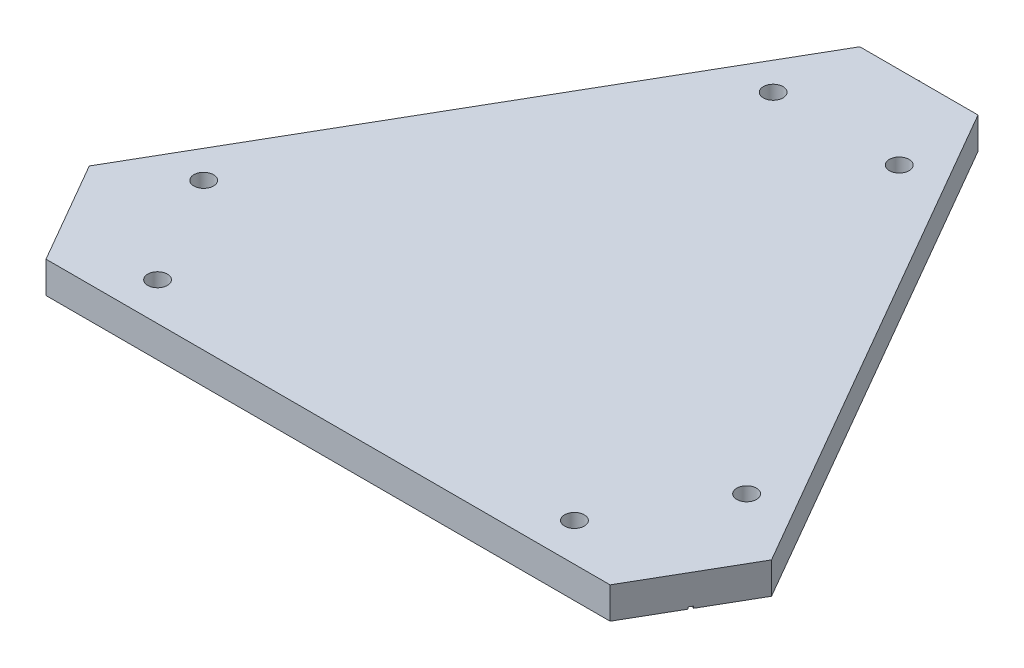
ISO-10303-21;
HEADER;
FILE_DESCRIPTION(('STEP AP214'),'2;1');
FILE_NAME('part.step','',(''),(''),'','','');
FILE_SCHEMA(('AUTOMOTIVE_DESIGN { 1 0 10303 214 1 1 1 1 }'));
ENDSEC;
DATA;
#1=APPLICATION_CONTEXT('core data for automotive mechanical design processes');
#2=APPLICATION_PROTOCOL_DEFINITION('international standard','automotive_design',2000,#1);
#3=PRODUCT_CONTEXT('',#1,'mechanical');
#4=PRODUCT('Part','Part','',(#3));
#5=PRODUCT_RELATED_PRODUCT_CATEGORY('part','',(#4));
#6=PRODUCT_DEFINITION_FORMATION('','',#4);
#7=PRODUCT_DEFINITION_CONTEXT('part definition',#1,'design');
#8=PRODUCT_DEFINITION('design','',#6,#7);
#9=PRODUCT_DEFINITION_SHAPE('','',#8);
#10=(LENGTH_UNIT() NAMED_UNIT(*) SI_UNIT(.MILLI.,.METRE.));
#11=(NAMED_UNIT(*) PLANE_ANGLE_UNIT() SI_UNIT($,.RADIAN.));
#12=(NAMED_UNIT(*) SI_UNIT($,.STERADIAN.) SOLID_ANGLE_UNIT());
#13=UNCERTAINTY_MEASURE_WITH_UNIT(LENGTH_MEASURE(1.E-05),#10,'distance_accuracy_value','');
#14=(GEOMETRIC_REPRESENTATION_CONTEXT(3) GLOBAL_UNCERTAINTY_ASSIGNED_CONTEXT((#13)) GLOBAL_UNIT_ASSIGNED_CONTEXT((#10,
#11,#12)) REPRESENTATION_CONTEXT('',''));
#15=CARTESIAN_POINT('',(0.,0.,0.));
#16=DIRECTION('',(0.,0.,1.));
#17=DIRECTION('',(1.,0.,0.));
#18=AXIS2_PLACEMENT_3D('',#15,#16,#17);
#19=CARTESIAN_POINT('',(-15.,8.,-150.));
#20=DIRECTION('',(0.866025403784439,0.,0.5));
#21=DIRECTION('',(0.5,0.,-0.866025403784439));
#22=AXIS2_PLACEMENT_3D('',#19,#20,#21);
#23=PLANE('',#22);
#24=DIRECTION('',(-0.5,0.,0.866025403784439));
#25=VECTOR('',#24,1.);
#26=CARTESIAN_POINT('',(-15.,0.,-150.));
#27=LINE('',#26,#25);
#28=CARTESIAN_POINT('',(-15.,0.,-150.));
#29=VERTEX_POINT('',#28);
#30=CARTESIAN_POINT('',(-86.6025403784438,0.,-25.9807621135332));
#31=VERTEX_POINT('',#30);
#32=EDGE_CURVE('E323',#29,#31,#27,.T.);
#33=ORIENTED_EDGE('',*,*,#32,.T.);
#34=DIRECTION('',(0.,-1.,0.));
#35=VECTOR('',#34,1.);
#36=CARTESIAN_POINT('',(-86.6025403784438,8.,-25.9807621135332));
#37=LINE('',#36,#35);
#38=CARTESIAN_POINT('',(-86.6025403784438,8.,-25.9807621135332));
#39=VERTEX_POINT('',#38);
#40=EDGE_CURVE('E356',#39,#31,#37,.T.);
#41=ORIENTED_EDGE('',*,*,#40,.F.);
#42=DIRECTION('',(-0.5,0.,0.866025403784439));
#43=VECTOR('',#42,1.);
#44=CARTESIAN_POINT('',(-15.,8.,-150.));
#45=LINE('',#44,#43);
#46=CARTESIAN_POINT('',(-15.,8.,-150.));
#47=VERTEX_POINT('',#46);
#48=EDGE_CURVE('E305',#47,#39,#45,.T.);
#49=ORIENTED_EDGE('',*,*,#48,.F.);
#50=DIRECTION('',(0.,-1.,0.));
#51=VECTOR('',#50,1.);
#52=CARTESIAN_POINT('',(-15.,8.,-150.));
#53=LINE('',#52,#51);
#54=EDGE_CURVE('E321',#47,#29,#53,.T.);
#55=ORIENTED_EDGE('',*,*,#54,.T.);
#56=EDGE_LOOP('',(#33,#41,#49,#55));
#57=FACE_BOUND('',#56,.T.);
#58=ADVANCED_FACE('F33',(#57),#23,.F.);
#59=CARTESIAN_POINT('',(-86.6025403784438,8.,-25.9807621135332));
#60=DIRECTION('',(0.866025403784438,0.,-0.5));
#61=DIRECTION('',(-0.5,0.,-0.866025403784438));
#62=AXIS2_PLACEMENT_3D('',#59,#60,#61);
#63=PLANE('',#62);
#64=DIRECTION('',(-0.500000000000002,0.,-0.866025403784438));
#65=VECTOR('',#64,1.);
#66=CARTESIAN_POINT('',(-79.3525403784439,0.437005550207173,-13.4233937586588));
#67=LINE('',#66,#65);
#68=CARTESIAN_POINT('',(-78.8525403784439,0.437005550207173,-12.5573683548743));
#69=VERTEX_POINT('',#68);
#70=CARTESIAN_POINT('',(-79.3525403784439,0.437005550207173,-13.4233937586588));
#71=VERTEX_POINT('',#70);
#72=EDGE_CURVE('E244',#69,#71,#67,.T.);
#73=ORIENTED_EDGE('',*,*,#72,.F.);
#74=DIRECTION('',(0.,1.,0.));
#75=VECTOR('',#74,1.);
#76=CARTESIAN_POINT('',(-78.8525403784439,-0.437005550207173,-12.5573683548743));
#77=LINE('',#76,#75);
#78=CARTESIAN_POINT('',(-78.8525403784439,0.,-12.5573683548743));
#79=VERTEX_POINT('',#78);
#80=EDGE_CURVE('E231',#79,#69,#77,.T.);
#81=ORIENTED_EDGE('',*,*,#80,.F.);
#82=DIRECTION('',(0.5,0.,0.866025403784438));
#83=VECTOR('',#82,1.);
#84=CARTESIAN_POINT('',(-86.6025403784438,0.,-25.9807621135332));
#85=LINE('',#84,#83);
#86=CARTESIAN_POINT('',(-71.6025403784438,0.,0.));
#87=VERTEX_POINT('',#86);
#88=EDGE_CURVE('E326',#79,#87,#85,.T.);
#89=ORIENTED_EDGE('',*,*,#88,.T.);
#90=DIRECTION('',(0.,-1.,0.));
#91=VECTOR('',#90,1.);
#92=CARTESIAN_POINT('',(-71.6025403784438,8.,0.));
#93=LINE('',#92,#91);
#94=CARTESIAN_POINT('',(-71.6025403784438,8.,0.));
#95=VERTEX_POINT('',#94);
#96=EDGE_CURVE('E353',#95,#87,#93,.T.);
#97=ORIENTED_EDGE('',*,*,#96,.F.);
#98=DIRECTION('',(0.5,0.,0.866025403784438));
#99=VECTOR('',#98,1.);
#100=CARTESIAN_POINT('',(-86.6025403784438,8.,-25.9807621135332));
#101=LINE('',#100,#99);
#102=EDGE_CURVE('E308',#39,#95,#101,.T.);
#103=ORIENTED_EDGE('',*,*,#102,.F.);
#104=ORIENTED_EDGE('',*,*,#40,.T.);
#105=CARTESIAN_POINT('',(-79.3525403784439,0.,-13.4233937586588));
#106=VERTEX_POINT('',#105);
#107=EDGE_CURVE('E328',#31,#106,#85,.T.);
#108=ORIENTED_EDGE('',*,*,#107,.T.);
#109=DIRECTION('',(0.,-1.,0.));
#110=VECTOR('',#109,1.);
#111=CARTESIAN_POINT('',(-79.3525403784439,-0.437005550207173,-13.4233937586588));
#112=LINE('',#111,#110);
#113=EDGE_CURVE('E237',#71,#106,#112,.T.);
#114=ORIENTED_EDGE('',*,*,#113,.F.);
#115=EDGE_LOOP('',(#73,#81,#89,#97,#103,#104,#108,#114));
#116=FACE_BOUND('',#115,.T.);
#117=ADVANCED_FACE('F437',(#116),#63,.F.);
#118=CARTESIAN_POINT('',(-71.6025403784438,8.,0.));
#119=DIRECTION('',(0.,0.,-1.));
#120=DIRECTION('',(-1.,0.,0.));
#121=AXIS2_PLACEMENT_3D('',#118,#119,#120);
#122=PLANE('',#121);
#123=DIRECTION('',(1.,0.,0.));
#124=VECTOR('',#123,1.);
#125=CARTESIAN_POINT('',(-71.6025403784438,0.,0.));
#126=LINE('',#125,#124);
#127=CARTESIAN_POINT('',(71.6025403784439,0.,0.));
#128=VERTEX_POINT('',#127);
#129=EDGE_CURVE('E331',#87,#128,#126,.T.);
#130=ORIENTED_EDGE('',*,*,#129,.T.);
#131=DIRECTION('',(0.,-1.,0.));
#132=VECTOR('',#131,1.);
#133=CARTESIAN_POINT('',(71.6025403784439,8.,0.));
#134=LINE('',#133,#132);
#135=CARTESIAN_POINT('',(71.6025403784439,8.,0.));
#136=VERTEX_POINT('',#135);
#137=EDGE_CURVE('E350',#136,#128,#134,.T.);
#138=ORIENTED_EDGE('',*,*,#137,.F.);
#139=DIRECTION('',(1.,0.,0.));
#140=VECTOR('',#139,1.);
#141=CARTESIAN_POINT('',(-71.6025403784438,8.,0.));
#142=LINE('',#141,#140);
#143=EDGE_CURVE('E311',#95,#136,#142,.T.);
#144=ORIENTED_EDGE('',*,*,#143,.F.);
#145=ORIENTED_EDGE('',*,*,#96,.T.);
#146=EDGE_LOOP('',(#130,#138,#144,#145));
#147=FACE_BOUND('',#146,.T.);
#148=ADVANCED_FACE('F431',(#147),#122,.F.);
#149=CARTESIAN_POINT('',(71.6025403784439,8.,0.));
#150=DIRECTION('',(-0.866025403784439,0.,-0.5));
#151=DIRECTION('',(-0.5,0.,0.866025403784439));
#152=AXIS2_PLACEMENT_3D('',#149,#150,#151);
#153=PLANE('',#152);
#154=DIRECTION('',(-0.499999999999998,0.,0.866025403784439));
#155=VECTOR('',#154,1.);
#156=CARTESIAN_POINT('',(78.8525403784439,0.5,-12.5573683548744));
#157=LINE('',#156,#155);
#158=CARTESIAN_POINT('',(79.3525403784439,0.5,-13.4233937586588));
#159=VERTEX_POINT('',#158);
#160=CARTESIAN_POINT('',(78.8525403784439,0.5,-12.5573683548744));
#161=VERTEX_POINT('',#160);
#162=EDGE_CURVE('E225',#159,#161,#157,.T.);
#163=ORIENTED_EDGE('',*,*,#162,.F.);
#164=DIRECTION('',(0.,1.,0.));
#165=VECTOR('',#164,1.);
#166=CARTESIAN_POINT('',(79.3525403784439,-0.5,-13.4233937586588));
#167=LINE('',#166,#165);
#168=CARTESIAN_POINT('',(79.3525403784439,0.,-13.4233937586588));
#169=VERTEX_POINT('',#168);
#170=EDGE_CURVE('E215',#169,#159,#167,.T.);
#171=ORIENTED_EDGE('',*,*,#170,.F.);
#172=DIRECTION('',(0.5,0.,-0.866025403784439));
#173=VECTOR('',#172,1.);
#174=CARTESIAN_POINT('',(71.6025403784439,0.,0.));
#175=LINE('',#174,#173);
#176=CARTESIAN_POINT('',(86.6025403784439,0.,-25.9807621135332));
#177=VERTEX_POINT('',#176);
#178=EDGE_CURVE('E333',#169,#177,#175,.T.);
#179=ORIENTED_EDGE('',*,*,#178,.T.);
#180=DIRECTION('',(0.,-1.,0.));
#181=VECTOR('',#180,1.);
#182=CARTESIAN_POINT('',(86.6025403784439,8.,-25.9807621135332));
#183=LINE('',#182,#181);
#184=CARTESIAN_POINT('',(86.6025403784439,8.,-25.9807621135332));
#185=VERTEX_POINT('',#184);
#186=EDGE_CURVE('E347',#185,#177,#183,.T.);
#187=ORIENTED_EDGE('',*,*,#186,.F.);
#188=DIRECTION('',(0.5,0.,-0.866025403784439));
#189=VECTOR('',#188,1.);
#190=CARTESIAN_POINT('',(71.6025403784439,8.,0.));
#191=LINE('',#190,#189);
#192=EDGE_CURVE('E313',#136,#185,#191,.T.);
#193=ORIENTED_EDGE('',*,*,#192,.F.);
#194=ORIENTED_EDGE('',*,*,#137,.T.);
#195=CARTESIAN_POINT('',(78.8525403784439,0.,-12.5573683548744));
#196=VERTEX_POINT('',#195);
#197=EDGE_CURVE('E334',#128,#196,#175,.T.);
#198=ORIENTED_EDGE('',*,*,#197,.T.);
#199=DIRECTION('',(0.,-1.,0.));
#200=VECTOR('',#199,1.);
#201=CARTESIAN_POINT('',(78.8525403784439,-0.5,-12.5573683548744));
#202=LINE('',#201,#200);
#203=EDGE_CURVE('E220',#161,#196,#202,.T.);
#204=ORIENTED_EDGE('',*,*,#203,.F.);
#205=EDGE_LOOP('',(#163,#171,#179,#187,#193,#194,#198,#204));
#206=FACE_BOUND('',#205,.T.);
#207=ADVANCED_FACE('F414',(#206),#153,.F.);
#208=CARTESIAN_POINT('',(86.6025403784439,8.,-25.9807621135332));
#209=DIRECTION('',(-0.866025403784438,0.,0.5));
#210=DIRECTION('',(0.5,0.,0.866025403784438));
#211=AXIS2_PLACEMENT_3D('',#208,#209,#210);
#212=PLANE('',#211);
#213=DIRECTION('',(-0.5,0.,-0.866025403784438));
#214=VECTOR('',#213,1.);
#215=CARTESIAN_POINT('',(86.6025403784439,0.,-25.9807621135332));
#216=LINE('',#215,#214);
#217=CARTESIAN_POINT('',(15.,0.,-150.));
#218=VERTEX_POINT('',#217);
#219=EDGE_CURVE('E337',#177,#218,#216,.T.);
#220=ORIENTED_EDGE('',*,*,#219,.T.);
#221=DIRECTION('',(0.,-1.,0.));
#222=VECTOR('',#221,1.);
#223=CARTESIAN_POINT('',(15.,8.,-150.));
#224=LINE('',#223,#222);
#225=CARTESIAN_POINT('',(15.,8.,-150.));
#226=VERTEX_POINT('',#225);
#227=EDGE_CURVE('E344',#226,#218,#224,.T.);
#228=ORIENTED_EDGE('',*,*,#227,.F.);
#229=DIRECTION('',(-0.5,0.,-0.866025403784438));
#230=VECTOR('',#229,1.);
#231=CARTESIAN_POINT('',(86.6025403784439,8.,-25.9807621135332));
#232=LINE('',#231,#230);
#233=EDGE_CURVE('E315',#185,#226,#232,.T.);
#234=ORIENTED_EDGE('',*,*,#233,.F.);
#235=ORIENTED_EDGE('',*,*,#186,.T.);
#236=EDGE_LOOP('',(#220,#228,#234,#235));
#237=FACE_BOUND('',#236,.T.);
#238=ADVANCED_FACE('F408',(#237),#212,.F.);
#239=CARTESIAN_POINT('',(-15.,8.,-150.));
#240=DIRECTION('',(0.,0.,1.));
#241=DIRECTION('',(1.,0.,0.));
#242=AXIS2_PLACEMENT_3D('',#239,#240,#241);
#243=PLANE('',#242);
#244=DIRECTION('',(1.,0.,0.));
#245=VECTOR('',#244,1.);
#246=CARTESIAN_POINT('',(0.499999999999972,0.5,-150.));
#247=LINE('',#246,#245);
#248=CARTESIAN_POINT('',(-0.500000000000028,0.5,-150.));
#249=VERTEX_POINT('',#248);
#250=CARTESIAN_POINT('',(0.499999999999972,0.5,-150.));
#251=VERTEX_POINT('',#250);
#252=EDGE_CURVE('E212',#249,#251,#247,.T.);
#253=ORIENTED_EDGE('',*,*,#252,.F.);
#254=DIRECTION('',(0.,1.,0.));
#255=VECTOR('',#254,1.);
#256=CARTESIAN_POINT('',(-0.500000000000028,-0.5,-150.));
#257=LINE('',#256,#255);
#258=CARTESIAN_POINT('',(-0.500000000000028,0.,-150.));
#259=VERTEX_POINT('',#258);
#260=EDGE_CURVE('E201',#259,#249,#257,.T.);
#261=ORIENTED_EDGE('',*,*,#260,.F.);
#262=DIRECTION('',(-1.,0.,0.));
#263=VECTOR('',#262,1.);
#264=CARTESIAN_POINT('',(-15.,0.,-150.));
#265=LINE('',#264,#263);
#266=EDGE_CURVE('E339',#259,#29,#265,.T.);
#267=ORIENTED_EDGE('',*,*,#266,.T.);
#268=ORIENTED_EDGE('',*,*,#54,.F.);
#269=DIRECTION('',(-1.,0.,0.));
#270=VECTOR('',#269,1.);
#271=CARTESIAN_POINT('',(-15.,8.,-150.));
#272=LINE('',#271,#270);
#273=CARTESIAN_POINT('',(-0.0500000000000049,8.,-150.));
#274=VERTEX_POINT('',#273);
#275=EDGE_CURVE('E317',#274,#47,#272,.T.);
#276=ORIENTED_EDGE('',*,*,#275,.F.);
#277=CARTESIAN_POINT('',(0.0499999999999962,8.,-150.));
#278=VERTEX_POINT('',#277);
#279=EDGE_CURVE('E322',#278,#274,#272,.T.);
#280=ORIENTED_EDGE('',*,*,#279,.F.);
#281=EDGE_CURVE('E318',#226,#278,#272,.T.);
#282=ORIENTED_EDGE('',*,*,#281,.F.);
#283=ORIENTED_EDGE('',*,*,#227,.T.);
#284=CARTESIAN_POINT('',(0.499999999999972,0.,-150.));
#285=VERTEX_POINT('',#284);
#286=EDGE_CURVE('E309',#218,#285,#265,.T.);
#287=ORIENTED_EDGE('',*,*,#286,.T.);
#288=DIRECTION('',(0.,-1.,0.));
#289=VECTOR('',#288,1.);
#290=CARTESIAN_POINT('',(0.499999999999972,-0.5,-150.));
#291=LINE('',#290,#289);
#292=EDGE_CURVE('E195',#251,#285,#291,.T.);
#293=ORIENTED_EDGE('',*,*,#292,.F.);
#294=EDGE_LOOP('',(#253,#261,#267,#268,#276,#280,#282,#283,#287,#293));
#295=FACE_BOUND('',#294,.T.);
#296=ADVANCED_FACE('F403',(#295),#243,.F.);
#297=CARTESIAN_POINT('',(0.,8.,0.));
#298=DIRECTION('',(0.,1.,0.));
#299=DIRECTION('',(0.,0.,1.));
#300=AXIS2_PLACEMENT_3D('',#297,#298,#299);
#301=PLANE('',#300);
#302=DIRECTION('',(0.,0.,-1.));
#303=VECTOR('',#302,1.);
#304=CARTESIAN_POINT('',(0.0499999999999956,8.,-150.05));
#305=LINE('',#304,#303);
#306=CARTESIAN_POINT('',(0.0499999999999956,8.,-149.95));
#307=VERTEX_POINT('',#306);
#308=EDGE_CURVE('E264',#307,#278,#305,.T.);
#309=ORIENTED_EDGE('',*,*,#308,.F.);
#310=DIRECTION('',(1.,0.,0.));
#311=VECTOR('',#310,1.);
#312=CARTESIAN_POINT('',(-0.0500000000000044,8.,-149.95));
#313=LINE('',#312,#311);
#314=CARTESIAN_POINT('',(-0.0500000000000044,8.,-149.95));
#315=VERTEX_POINT('',#314);
#316=EDGE_CURVE('E257',#315,#307,#313,.T.);
#317=ORIENTED_EDGE('',*,*,#316,.F.);
#318=DIRECTION('',(0.,0.,1.));
#319=VECTOR('',#318,1.);
#320=CARTESIAN_POINT('',(-0.0500000000000044,8.,-150.05));
#321=LINE('',#320,#319);
#322=EDGE_CURVE('E272',#274,#315,#321,.T.);
#323=ORIENTED_EDGE('',*,*,#322,.F.);
#324=ORIENTED_EDGE('',*,*,#275,.T.);
#325=ORIENTED_EDGE('',*,*,#48,.T.);
#326=ORIENTED_EDGE('',*,*,#102,.T.);
#327=ORIENTED_EDGE('',*,*,#143,.T.);
#328=ORIENTED_EDGE('',*,*,#192,.T.);
#329=ORIENTED_EDGE('',*,*,#233,.T.);
#330=ORIENTED_EDGE('',*,*,#281,.T.);
#331=EDGE_LOOP('',(#309,#317,#323,#324,#325,#326,#327,#328,#329,#330));
#332=FACE_BOUND('',#331,.T.);
#333=CARTESIAN_POINT('',(68.9160068989707,8.,-37.3467875173176));
#334=DIRECTION('',(0.,1.,0.));
#335=DIRECTION('',(0.,0.,1.));
#336=AXIS2_PLACEMENT_3D('',#333,#334,#335);
#337=CIRCLE('',#336,2.49999999999997);
#338=CARTESIAN_POINT('',(68.9160068989707,8.,-34.8467875173176));
#339=VERTEX_POINT('',#338);
#340=EDGE_CURVE('E286',#339,#339,#337,.T.);
#341=ORIENTED_EDGE('',*,*,#340,.F.);
#342=EDGE_LOOP('',(#341));
#343=FACE_BOUND('',#342,.T.);
#344=CARTESIAN_POINT('',(16.,8.,-129.));
#345=DIRECTION('',(0.,1.,0.));
#346=DIRECTION('',(0.,0.,1.));
#347=AXIS2_PLACEMENT_3D('',#344,#345,#346);
#348=CIRCLE('',#347,2.5);
#349=CARTESIAN_POINT('',(16.,8.,-126.5));
#350=VERTEX_POINT('',#349);
#351=EDGE_CURVE('E294',#350,#350,#348,.T.);
#352=ORIENTED_EDGE('',*,*,#351,.F.);
#353=EDGE_LOOP('',(#352));
#354=FACE_BOUND('',#353,.T.);
#355=CARTESIAN_POINT('',(-52.9160068989706,8.,-9.63397459621556));
#356=DIRECTION('',(0.,1.,0.));
#357=DIRECTION('',(0.,0.,1.));
#358=AXIS2_PLACEMENT_3D('',#355,#356,#357);
#359=CIRCLE('',#358,2.5);
#360=CARTESIAN_POINT('',(-52.9160068989706,8.,-7.13397459621556));
#361=VERTEX_POINT('',#360);
#362=EDGE_CURVE('E290',#361,#361,#359,.T.);
#363=ORIENTED_EDGE('',*,*,#362,.F.);
#364=EDGE_LOOP('',(#363));
#365=FACE_BOUND('',#364,.T.);
#366=CARTESIAN_POINT('',(-68.9160068989706,8.,-37.3467875173176));
#367=DIRECTION('',(0.,1.,0.));
#368=DIRECTION('',(0.,0.,1.));
#369=AXIS2_PLACEMENT_3D('',#366,#367,#368);
#370=CIRCLE('',#369,2.49999999999998);
#371=CARTESIAN_POINT('',(-68.9160068989706,8.,-34.8467875173176));
#372=VERTEX_POINT('',#371);
#373=EDGE_CURVE('E287',#372,#372,#370,.T.);
#374=ORIENTED_EDGE('',*,*,#373,.F.);
#375=EDGE_LOOP('',(#374));
#376=FACE_BOUND('',#375,.T.);
#377=CARTESIAN_POINT('',(52.9160068989707,8.,-9.63397459621557));
#378=DIRECTION('',(0.,1.,0.));
#379=DIRECTION('',(0.,0.,1.));
#380=AXIS2_PLACEMENT_3D('',#377,#378,#379);
#381=CIRCLE('',#380,2.49999999999997);
#382=CARTESIAN_POINT('',(52.9160068989707,8.,-7.1339745962156));
#383=VERTEX_POINT('',#382);
#384=EDGE_CURVE('E291',#383,#383,#381,.T.);
#385=ORIENTED_EDGE('',*,*,#384,.F.);
#386=EDGE_LOOP('',(#385));
#387=FACE_BOUND('',#386,.T.);
#388=CARTESIAN_POINT('',(-16.,8.,-129.));
#389=DIRECTION('',(0.,1.,0.));
#390=DIRECTION('',(0.,0.,1.));
#391=AXIS2_PLACEMENT_3D('',#388,#389,#390);
#392=CIRCLE('',#391,2.5);
#393=CARTESIAN_POINT('',(-16.,8.,-126.5));
#394=VERTEX_POINT('',#393);
#395=EDGE_CURVE('E297',#394,#394,#392,.T.);
#396=ORIENTED_EDGE('',*,*,#395,.F.);
#397=EDGE_LOOP('',(#396));
#398=FACE_BOUND('',#397,.T.);
#399=ADVANCED_FACE('F459',(#332,#343,#354,#365,#376,#387,#398),#301,.T.);
#400=CARTESIAN_POINT('',(0.,0.,0.));
#401=DIRECTION('',(0.,1.,0.));
#402=DIRECTION('',(0.,0.,1.));
#403=AXIS2_PLACEMENT_3D('',#400,#401,#402);
#404=PLANE('',#403);
#405=ORIENTED_EDGE('',*,*,#266,.F.);
#406=DIRECTION('',(0.,0.,1.));
#407=VECTOR('',#406,1.);
#408=CARTESIAN_POINT('',(-0.499999999999889,0.,0.));
#409=LINE('',#408,#407);
#410=CARTESIAN_POINT('',(-0.500000000000019,0.,-140.));
#411=VERTEX_POINT('',#410);
#412=EDGE_CURVE('E11',#259,#411,#409,.T.);
#413=ORIENTED_EDGE('',*,*,#412,.T.);
#414=DIRECTION('',(1.,0.,0.));
#415=VECTOR('',#414,1.);
#416=CARTESIAN_POINT('',(0.,0.,-140.));
#417=LINE('',#416,#415);
#418=CARTESIAN_POINT('',(0.499999999999981,0.,-140.));
#419=VERTEX_POINT('',#418);
#420=EDGE_CURVE('E193',#411,#419,#417,.T.);
#421=ORIENTED_EDGE('',*,*,#420,.T.);
#422=DIRECTION('',(0.,0.,-1.));
#423=VECTOR('',#422,1.);
#424=CARTESIAN_POINT('',(0.500000000000111,0.,0.));
#425=LINE('',#424,#423);
#426=EDGE_CURVE('E40',#419,#285,#425,.T.);
#427=ORIENTED_EDGE('',*,*,#426,.T.);
#428=ORIENTED_EDGE('',*,*,#286,.F.);
#429=ORIENTED_EDGE('',*,*,#219,.F.);
#430=ORIENTED_EDGE('',*,*,#178,.F.);
#431=DIRECTION('',(-0.866025403784439,0.,-0.5));
#432=VECTOR('',#431,1.);
#433=CARTESIAN_POINT('',(25.6506350946109,0.,-44.4282032302755));
#434=LINE('',#433,#432);
#435=CARTESIAN_POINT('',(70.6922863405995,0.,-18.4233937586588));
#436=VERTEX_POINT('',#435);
#437=EDGE_CURVE('E390',#169,#436,#434,.T.);
#438=ORIENTED_EDGE('',*,*,#437,.T.);
#439=DIRECTION('',(-0.499999999999999,0.,0.86602540378444));
#440=VECTOR('',#439,1.);
#441=CARTESIAN_POINT('',(45.0416512459887,0.,26.0048094716167));
#442=LINE('',#441,#440);
#443=CARTESIAN_POINT('',(70.1922863405995,0.,-17.5573683548743));
#444=VERTEX_POINT('',#443);
#445=EDGE_CURVE('E384',#436,#444,#442,.T.);
#446=ORIENTED_EDGE('',*,*,#445,.T.);
#447=DIRECTION('',(0.866025403784439,0.,0.5));
#448=VECTOR('',#447,1.);
#449=CARTESIAN_POINT('',(25.1506350946109,0.,-43.5621778264911));
#450=LINE('',#449,#448);
#451=EDGE_CURVE('E387',#444,#196,#450,.T.);
#452=ORIENTED_EDGE('',*,*,#451,.T.);
#453=ORIENTED_EDGE('',*,*,#197,.F.);
#454=ORIENTED_EDGE('',*,*,#129,.F.);
#455=ORIENTED_EDGE('',*,*,#88,.F.);
#456=DIRECTION('',(0.866025403784438,0.,-0.500000000000001));
#457=VECTOR('',#456,1.);
#458=CARTESIAN_POINT('',(-25.150635094611,0.,-43.5621778264911));
#459=LINE('',#458,#457);
#460=CARTESIAN_POINT('',(-70.1922863405995,0.,-17.5573683548744));
#461=VERTEX_POINT('',#460);
#462=EDGE_CURVE('E381',#79,#461,#459,.T.);
#463=ORIENTED_EDGE('',*,*,#462,.T.);
#464=DIRECTION('',(-0.500000000000002,0.,-0.866025403784438));
#465=VECTOR('',#464,1.);
#466=CARTESIAN_POINT('',(-45.0416512459884,0.,26.0048094716168));
#467=LINE('',#466,#465);
#468=CARTESIAN_POINT('',(-70.6922863405995,0.,-18.4233937586588));
#469=VERTEX_POINT('',#468);
#470=EDGE_CURVE('E375',#461,#469,#467,.T.);
#471=ORIENTED_EDGE('',*,*,#470,.T.);
#472=DIRECTION('',(-0.866025403784438,0.,0.500000000000001));
#473=VECTOR('',#472,1.);
#474=CARTESIAN_POINT('',(-25.650635094611,0.,-44.4282032302755));
#475=LINE('',#474,#473);
#476=EDGE_CURVE('E378',#469,#106,#475,.T.);
#477=ORIENTED_EDGE('',*,*,#476,.T.);
#478=ORIENTED_EDGE('',*,*,#107,.F.);
#479=ORIENTED_EDGE('',*,*,#32,.F.);
#480=EDGE_LOOP('',(#405,#413,#421,#427,#428,#429,#430,#438,#446,#452,#453,#454,#455,#463,#471,
#477,#478,#479));
#481=FACE_BOUND('',#480,.T.);
#482=CARTESIAN_POINT('',(68.9160068989707,0.,-37.3467875173176));
#483=DIRECTION('',(0.,1.,0.));
#484=DIRECTION('',(0.,0.,1.));
#485=AXIS2_PLACEMENT_3D('',#482,#483,#484);
#486=CIRCLE('',#485,2.49999999999997);
#487=CARTESIAN_POINT('',(68.9160068989707,0.,-34.8467875173176));
#488=VERTEX_POINT('',#487);
#489=EDGE_CURVE('E327',#488,#488,#486,.T.);
#490=ORIENTED_EDGE('',*,*,#489,.T.);
#491=EDGE_LOOP('',(#490));
#492=FACE_BOUND('',#491,.T.);
#493=CARTESIAN_POINT('',(16.,0.,-129.));
#494=DIRECTION('',(0.,1.,0.));
#495=DIRECTION('',(0.,0.,1.));
#496=AXIS2_PLACEMENT_3D('',#493,#494,#495);
#497=CIRCLE('',#496,2.5);
#498=CARTESIAN_POINT('',(16.,0.,-126.5));
#499=VERTEX_POINT('',#498);
#500=EDGE_CURVE('E370',#499,#499,#497,.T.);
#501=ORIENTED_EDGE('',*,*,#500,.T.);
#502=EDGE_LOOP('',(#501));
#503=FACE_BOUND('',#502,.T.);
#504=CARTESIAN_POINT('',(-52.9160068989706,0.,-9.63397459621556));
#505=DIRECTION('',(0.,1.,0.));
#506=DIRECTION('',(0.,0.,1.));
#507=AXIS2_PLACEMENT_3D('',#504,#505,#506);
#508=CIRCLE('',#507,2.5);
#509=CARTESIAN_POINT('',(-52.9160068989706,0.,-7.13397459621556));
#510=VERTEX_POINT('',#509);
#511=EDGE_CURVE('E367',#510,#510,#508,.T.);
#512=ORIENTED_EDGE('',*,*,#511,.T.);
#513=EDGE_LOOP('',(#512));
#514=FACE_BOUND('',#513,.T.);
#515=CARTESIAN_POINT('',(-68.9160068989706,0.,-37.3467875173176));
#516=DIRECTION('',(0.,1.,0.));
#517=DIRECTION('',(0.,0.,1.));
#518=AXIS2_PLACEMENT_3D('',#515,#516,#517);
#519=CIRCLE('',#518,2.49999999999998);
#520=CARTESIAN_POINT('',(-68.9160068989706,0.,-34.8467875173176));
#521=VERTEX_POINT('',#520);
#522=EDGE_CURVE('E364',#521,#521,#519,.T.);
#523=ORIENTED_EDGE('',*,*,#522,.T.);
#524=EDGE_LOOP('',(#523));
#525=FACE_BOUND('',#524,.T.);
#526=CARTESIAN_POINT('',(52.9160068989707,0.,-9.63397459621557));
#527=DIRECTION('',(0.,1.,0.));
#528=DIRECTION('',(0.,0.,1.));
#529=AXIS2_PLACEMENT_3D('',#526,#527,#528);
#530=CIRCLE('',#529,2.49999999999997);
#531=CARTESIAN_POINT('',(52.9160068989707,0.,-7.1339745962156));
#532=VERTEX_POINT('',#531);
#533=EDGE_CURVE('E361',#532,#532,#530,.T.);
#534=ORIENTED_EDGE('',*,*,#533,.T.);
#535=EDGE_LOOP('',(#534));
#536=FACE_BOUND('',#535,.T.);
#537=CARTESIAN_POINT('',(-16.,0.,-129.));
#538=DIRECTION('',(0.,1.,0.));
#539=DIRECTION('',(0.,0.,1.));
#540=AXIS2_PLACEMENT_3D('',#537,#538,#539);
#541=CIRCLE('',#540,2.5);
#542=CARTESIAN_POINT('',(-16.,0.,-126.5));
#543=VERTEX_POINT('',#542);
#544=EDGE_CURVE('E304',#543,#543,#541,.T.);
#545=ORIENTED_EDGE('',*,*,#544,.T.);
#546=EDGE_LOOP('',(#545));
#547=FACE_BOUND('',#546,.T.);
#548=ADVANCED_FACE('F397',(#481,#492,#503,#514,#525,#536,#547),#404,.F.);
#549=CARTESIAN_POINT('',(-16.,-23.,-129.));
#550=DIRECTION('',(0.,1.,0.));
#551=DIRECTION('',(0.,0.,1.));
#552=AXIS2_PLACEMENT_3D('',#549,#550,#551);
#553=CYLINDRICAL_SURFACE('',#552,2.5);
#554=ORIENTED_EDGE('',*,*,#395,.T.);
#555=EDGE_LOOP('',(#554));
#556=FACE_BOUND('',#555,.T.);
#557=ORIENTED_EDGE('',*,*,#544,.F.);
#558=EDGE_LOOP('',(#557));
#559=FACE_BOUND('',#558,.T.);
#560=ADVANCED_FACE('F512',(#556,#559),#553,.F.);
#561=CARTESIAN_POINT('',(52.9160068989707,-23.,-9.63397459621557));
#562=DIRECTION('',(0.,1.,0.));
#563=DIRECTION('',(0.,0.,1.));
#564=AXIS2_PLACEMENT_3D('',#561,#562,#563);
#565=CYLINDRICAL_SURFACE('',#564,2.49999999999997);
#566=ORIENTED_EDGE('',*,*,#384,.T.);
#567=EDGE_LOOP('',(#566));
#568=FACE_BOUND('',#567,.T.);
#569=ORIENTED_EDGE('',*,*,#533,.F.);
#570=EDGE_LOOP('',(#569));
#571=FACE_BOUND('',#570,.T.);
#572=ADVANCED_FACE('F517',(#568,#571),#565,.F.);
#573=CARTESIAN_POINT('',(-68.9160068989706,-23.,-37.3467875173176));
#574=DIRECTION('',(0.,1.,0.));
#575=DIRECTION('',(0.,0.,1.));
#576=AXIS2_PLACEMENT_3D('',#573,#574,#575);
#577=CYLINDRICAL_SURFACE('',#576,2.49999999999998);
#578=ORIENTED_EDGE('',*,*,#373,.T.);
#579=EDGE_LOOP('',(#578));
#580=FACE_BOUND('',#579,.T.);
#581=ORIENTED_EDGE('',*,*,#522,.F.);
#582=EDGE_LOOP('',(#581));
#583=FACE_BOUND('',#582,.T.);
#584=ADVANCED_FACE('F527',(#580,#583),#577,.F.);
#585=CARTESIAN_POINT('',(-52.9160068989706,-23.,-9.63397459621556));
#586=DIRECTION('',(0.,1.,0.));
#587=DIRECTION('',(0.,0.,1.));
#588=AXIS2_PLACEMENT_3D('',#585,#586,#587);
#589=CYLINDRICAL_SURFACE('',#588,2.5);
#590=ORIENTED_EDGE('',*,*,#362,.T.);
#591=EDGE_LOOP('',(#590));
#592=FACE_BOUND('',#591,.T.);
#593=ORIENTED_EDGE('',*,*,#511,.F.);
#594=EDGE_LOOP('',(#593));
#595=FACE_BOUND('',#594,.T.);
#596=ADVANCED_FACE('F524',(#592,#595),#589,.F.);
#597=CARTESIAN_POINT('',(16.,-23.,-129.));
#598=DIRECTION('',(0.,1.,0.));
#599=DIRECTION('',(0.,0.,1.));
#600=AXIS2_PLACEMENT_3D('',#597,#598,#599);
#601=CYLINDRICAL_SURFACE('',#600,2.5);
#602=ORIENTED_EDGE('',*,*,#351,.T.);
#603=EDGE_LOOP('',(#602));
#604=FACE_BOUND('',#603,.T.);
#605=ORIENTED_EDGE('',*,*,#500,.F.);
#606=EDGE_LOOP('',(#605));
#607=FACE_BOUND('',#606,.T.);
#608=ADVANCED_FACE('F522',(#604,#607),#601,.F.);
#609=CARTESIAN_POINT('',(68.9160068989707,-23.,-37.3467875173176));
#610=DIRECTION('',(0.,1.,0.));
#611=DIRECTION('',(0.,0.,1.));
#612=AXIS2_PLACEMENT_3D('',#609,#610,#611);
#613=CYLINDRICAL_SURFACE('',#612,2.49999999999997);
#614=ORIENTED_EDGE('',*,*,#340,.T.);
#615=EDGE_LOOP('',(#614));
#616=FACE_BOUND('',#615,.T.);
#617=ORIENTED_EDGE('',*,*,#489,.F.);
#618=EDGE_LOOP('',(#617));
#619=FACE_BOUND('',#618,.T.);
#620=ADVANCED_FACE('F519',(#616,#619),#613,.F.);
#621=CARTESIAN_POINT('',(0.,8.,0.));
#622=DIRECTION('',(0.,1.,0.));
#623=DIRECTION('',(0.,0.,1.));
#624=AXIS2_PLACEMENT_3D('',#621,#622,#623);
#625=PLANE('',#624);
#626=CARTESIAN_POINT('',(0.0499999999999956,8.,-150.05));
#627=VERTEX_POINT('',#626);
#628=EDGE_CURVE('E250',#278,#627,#305,.T.);
#629=ORIENTED_EDGE('',*,*,#628,.F.);
#630=ORIENTED_EDGE('',*,*,#279,.T.);
#631=CARTESIAN_POINT('',(-0.0500000000000044,8.,-150.05));
#632=VERTEX_POINT('',#631);
#633=EDGE_CURVE('E269',#632,#274,#321,.T.);
#634=ORIENTED_EDGE('',*,*,#633,.F.);
#635=DIRECTION('',(-1.,0.,0.));
#636=VECTOR('',#635,1.);
#637=CARTESIAN_POINT('',(-0.0500000000000044,8.,-150.05));
#638=LINE('',#637,#636);
#639=EDGE_CURVE('E267',#627,#632,#638,.T.);
#640=ORIENTED_EDGE('',*,*,#639,.F.);
#641=EDGE_LOOP('',(#629,#630,#634,#640));
#642=FACE_BOUND('',#641,.T.);
#643=ADVANCED_FACE('F465',(#642),#625,.F.);
#644=CARTESIAN_POINT('',(0.0499999999999956,8.1,-150.05));
#645=DIRECTION('',(-1.,0.,0.));
#646=DIRECTION('',(0.,0.,1.));
#647=AXIS2_PLACEMENT_3D('',#644,#645,#646);
#648=PLANE('',#647);
#649=ORIENTED_EDGE('',*,*,#308,.T.);
#650=ORIENTED_EDGE('',*,*,#628,.T.);
#651=DIRECTION('',(0.,-1.,0.));
#652=VECTOR('',#651,1.);
#653=CARTESIAN_POINT('',(0.0499999999999956,8.1,-150.05));
#654=LINE('',#653,#652);
#655=CARTESIAN_POINT('',(0.0499999999999956,8.1,-150.05));
#656=VERTEX_POINT('',#655);
#657=EDGE_CURVE('E283',#656,#627,#654,.T.);
#658=ORIENTED_EDGE('',*,*,#657,.F.);
#659=DIRECTION('',(0.,0.,-1.));
#660=VECTOR('',#659,1.);
#661=CARTESIAN_POINT('',(0.0499999999999956,8.1,-150.05));
#662=LINE('',#661,#660);
#663=CARTESIAN_POINT('',(0.0499999999999956,8.1,-149.95));
#664=VERTEX_POINT('',#663);
#665=EDGE_CURVE('E253',#664,#656,#662,.T.);
#666=ORIENTED_EDGE('',*,*,#665,.F.);
#667=DIRECTION('',(0.,-1.,0.));
#668=VECTOR('',#667,1.);
#669=CARTESIAN_POINT('',(0.0499999999999956,8.1,-149.95));
#670=LINE('',#669,#668);
#671=EDGE_CURVE('E263',#664,#307,#670,.T.);
#672=ORIENTED_EDGE('',*,*,#671,.T.);
#673=EDGE_LOOP('',(#649,#650,#658,#666,#672));
#674=FACE_BOUND('',#673,.T.);
#675=ADVANCED_FACE('F477',(#674),#648,.F.);
#676=CARTESIAN_POINT('',(-0.0500000000000044,8.1,-150.05));
#677=DIRECTION('',(0.,0.,1.));
#678=DIRECTION('',(1.,0.,0.));
#679=AXIS2_PLACEMENT_3D('',#676,#677,#678);
#680=PLANE('',#679);
#681=ORIENTED_EDGE('',*,*,#639,.T.);
#682=DIRECTION('',(0.,-1.,0.));
#683=VECTOR('',#682,1.);
#684=CARTESIAN_POINT('',(-0.0500000000000044,8.1,-150.05));
#685=LINE('',#684,#683);
#686=CARTESIAN_POINT('',(-0.0500000000000044,8.1,-150.05));
#687=VERTEX_POINT('',#686);
#688=EDGE_CURVE('E280',#687,#632,#685,.T.);
#689=ORIENTED_EDGE('',*,*,#688,.F.);
#690=DIRECTION('',(-1.,0.,0.));
#691=VECTOR('',#690,1.);
#692=CARTESIAN_POINT('',(-0.0500000000000044,8.1,-150.05));
#693=LINE('',#692,#691);
#694=EDGE_CURVE('E256',#656,#687,#693,.T.);
#695=ORIENTED_EDGE('',*,*,#694,.F.);
#696=ORIENTED_EDGE('',*,*,#657,.T.);
#697=EDGE_LOOP('',(#681,#689,#695,#696));
#698=FACE_BOUND('',#697,.T.);
#699=ADVANCED_FACE('F473',(#698),#680,.F.);
#700=CARTESIAN_POINT('',(-0.0500000000000044,8.1,-150.05));
#701=DIRECTION('',(1.,0.,0.));
#702=DIRECTION('',(0.,0.,-1.));
#703=AXIS2_PLACEMENT_3D('',#700,#701,#702);
#704=PLANE('',#703);
#705=ORIENTED_EDGE('',*,*,#633,.T.);
#706=ORIENTED_EDGE('',*,*,#322,.T.);
#707=DIRECTION('',(0.,-1.,0.));
#708=VECTOR('',#707,1.);
#709=CARTESIAN_POINT('',(-0.0500000000000044,8.1,-149.95));
#710=LINE('',#709,#708);
#711=CARTESIAN_POINT('',(-0.0500000000000044,8.1,-149.95));
#712=VERTEX_POINT('',#711);
#713=EDGE_CURVE('E277',#712,#315,#710,.T.);
#714=ORIENTED_EDGE('',*,*,#713,.F.);
#715=DIRECTION('',(0.,0.,1.));
#716=VECTOR('',#715,1.);
#717=CARTESIAN_POINT('',(-0.0500000000000044,8.1,-150.05));
#718=LINE('',#717,#716);
#719=EDGE_CURVE('E259',#687,#712,#718,.T.);
#720=ORIENTED_EDGE('',*,*,#719,.F.);
#721=ORIENTED_EDGE('',*,*,#688,.T.);
#722=EDGE_LOOP('',(#705,#706,#714,#720,#721));
#723=FACE_BOUND('',#722,.T.);
#724=ADVANCED_FACE('F468',(#723),#704,.F.);
#725=CARTESIAN_POINT('',(-0.0500000000000044,8.1,-149.95));
#726=DIRECTION('',(0.,0.,-1.));
#727=DIRECTION('',(-1.,0.,0.));
#728=AXIS2_PLACEMENT_3D('',#725,#726,#727);
#729=PLANE('',#728);
#730=ORIENTED_EDGE('',*,*,#316,.T.);
#731=ORIENTED_EDGE('',*,*,#671,.F.);
#732=DIRECTION('',(1.,0.,0.));
#733=VECTOR('',#732,1.);
#734=CARTESIAN_POINT('',(-0.0500000000000044,8.1,-149.95));
#735=LINE('',#734,#733);
#736=EDGE_CURVE('E261',#712,#664,#735,.T.);
#737=ORIENTED_EDGE('',*,*,#736,.F.);
#738=ORIENTED_EDGE('',*,*,#713,.T.);
#739=EDGE_LOOP('',(#730,#731,#737,#738));
#740=FACE_BOUND('',#739,.T.);
#741=ADVANCED_FACE('F480',(#740),#729,.F.);
#742=CARTESIAN_POINT('',(0.,8.1,0.));
#743=DIRECTION('',(0.,1.,0.));
#744=DIRECTION('',(0.,0.,1.));
#745=AXIS2_PLACEMENT_3D('',#742,#743,#744);
#746=PLANE('',#745);
#747=ORIENTED_EDGE('',*,*,#665,.T.);
#748=ORIENTED_EDGE('',*,*,#694,.T.);
#749=ORIENTED_EDGE('',*,*,#719,.T.);
#750=ORIENTED_EDGE('',*,*,#736,.T.);
#751=EDGE_LOOP('',(#747,#748,#749,#750));
#752=FACE_BOUND('',#751,.T.);
#753=ADVANCED_FACE('F483',(#752),#746,.T.);
#754=CARTESIAN_POINT('',(-70.1922863405995,-0.437005550207173,-17.5573683548744));
#755=DIRECTION('',(0.500000000000001,0.,0.866025403784438));
#756=DIRECTION('',(0.866025403784438,0.,-0.500000000000001));
#757=AXIS2_PLACEMENT_3D('',#754,#755,#756);
#758=PLANE('',#757);
#759=ORIENTED_EDGE('',*,*,#80,.T.);
#760=DIRECTION('',(-0.866025403784438,0.,0.500000000000001));
#761=VECTOR('',#760,1.);
#762=CARTESIAN_POINT('',(-70.1922863405995,0.437005550207173,-17.5573683548744));
#763=LINE('',#762,#761);
#764=CARTESIAN_POINT('',(-70.1922863405995,0.437005550207173,-17.5573683548744));
#765=VERTEX_POINT('',#764);
#766=EDGE_CURVE('E242',#765,#69,#763,.T.);
#767=ORIENTED_EDGE('',*,*,#766,.F.);
#768=DIRECTION('',(0.,1.,0.));
#769=VECTOR('',#768,1.);
#770=CARTESIAN_POINT('',(-70.1922863405995,-0.437005550207173,-17.5573683548744));
#771=LINE('',#770,#769);
#772=EDGE_CURVE('E234',#461,#765,#771,.T.);
#773=ORIENTED_EDGE('',*,*,#772,.F.);
#774=ORIENTED_EDGE('',*,*,#462,.F.);
#775=EDGE_LOOP('',(#759,#767,#773,#774));
#776=FACE_BOUND('',#775,.T.);
#777=ADVANCED_FACE('F441',(#776),#758,.F.);
#778=CARTESIAN_POINT('',(-70.6922863405995,-0.437005550207173,-18.4233937586588));
#779=DIRECTION('',(-0.500000000000001,0.,-0.866025403784438));
#780=DIRECTION('',(-0.866025403784438,0.,0.500000000000001));
#781=AXIS2_PLACEMENT_3D('',#778,#779,#780);
#782=PLANE('',#781);
#783=DIRECTION('',(0.,-1.,0.));
#784=VECTOR('',#783,1.);
#785=CARTESIAN_POINT('',(-70.6922863405995,-0.437005550207173,-18.4233937586588));
#786=LINE('',#785,#784);
#787=CARTESIAN_POINT('',(-70.6922863405995,0.437005550207173,-18.4233937586588));
#788=VERTEX_POINT('',#787);
#789=EDGE_CURVE('E240',#788,#469,#786,.T.);
#790=ORIENTED_EDGE('',*,*,#789,.F.);
#791=DIRECTION('',(-0.866025403784438,0.,0.500000000000001));
#792=VECTOR('',#791,1.);
#793=CARTESIAN_POINT('',(-70.6922863405995,0.437005550207173,-18.4233937586588));
#794=LINE('',#793,#792);
#795=EDGE_CURVE('E248',#788,#71,#794,.T.);
#796=ORIENTED_EDGE('',*,*,#795,.T.);
#797=ORIENTED_EDGE('',*,*,#113,.T.);
#798=ORIENTED_EDGE('',*,*,#476,.F.);
#799=EDGE_LOOP('',(#790,#796,#797,#798));
#800=FACE_BOUND('',#799,.T.);
#801=ADVANCED_FACE('F490',(#800),#782,.F.);
#802=CARTESIAN_POINT('',(-45.0416512459884,0.,26.0048094716168));
#803=DIRECTION('',(0.866025403784438,0.,-0.500000000000002));
#804=DIRECTION('',(-0.500000000000002,0.,-0.866025403784438));
#805=AXIS2_PLACEMENT_3D('',#802,#803,#804);
#806=PLANE('',#805);
#807=ORIENTED_EDGE('',*,*,#772,.T.);
#808=DIRECTION('',(-0.500000000000002,0.,-0.866025403784438));
#809=VECTOR('',#808,1.);
#810=CARTESIAN_POINT('',(-70.6922863405995,0.437005550207173,-18.4233937586588));
#811=LINE('',#810,#809);
#812=EDGE_CURVE('E236',#765,#788,#811,.T.);
#813=ORIENTED_EDGE('',*,*,#812,.T.);
#814=ORIENTED_EDGE('',*,*,#789,.T.);
#815=ORIENTED_EDGE('',*,*,#470,.F.);
#816=EDGE_LOOP('',(#807,#813,#814,#815));
#817=FACE_BOUND('',#816,.T.);
#818=ADVANCED_FACE('F448',(#817),#806,.F.);
#819=CARTESIAN_POINT('',(-70.6922863405995,0.437005550207173,-18.4233937586588));
#820=DIRECTION('',(0.,1.,0.));
#821=DIRECTION('',(0.,0.,1.));
#822=AXIS2_PLACEMENT_3D('',#819,#820,#821);
#823=PLANE('',#822);
#824=ORIENTED_EDGE('',*,*,#72,.T.);
#825=ORIENTED_EDGE('',*,*,#795,.F.);
#826=ORIENTED_EDGE('',*,*,#812,.F.);
#827=ORIENTED_EDGE('',*,*,#766,.T.);
#828=EDGE_LOOP('',(#824,#825,#826,#827));
#829=FACE_BOUND('',#828,.T.);
#830=ADVANCED_FACE('F445',(#829),#823,.F.);
#831=CARTESIAN_POINT('',(70.6922863405995,-0.5,-18.4233937586588));
#832=DIRECTION('',(0.5,0.,-0.866025403784439));
#833=DIRECTION('',(-0.866025403784439,0.,-0.5));
#834=AXIS2_PLACEMENT_3D('',#831,#832,#833);
#835=PLANE('',#834);
#836=ORIENTED_EDGE('',*,*,#170,.T.);
#837=DIRECTION('',(0.866025403784439,0.,0.5));
#838=VECTOR('',#837,1.);
#839=CARTESIAN_POINT('',(70.6922863405995,0.5,-18.4233937586588));
#840=LINE('',#839,#838);
#841=CARTESIAN_POINT('',(70.6922863405995,0.5,-18.4233937586588));
#842=VERTEX_POINT('',#841);
#843=EDGE_CURVE('E223',#842,#159,#840,.T.);
#844=ORIENTED_EDGE('',*,*,#843,.F.);
#845=DIRECTION('',(0.,1.,0.));
#846=VECTOR('',#845,1.);
#847=CARTESIAN_POINT('',(70.6922863405995,-0.5,-18.4233937586588));
#848=LINE('',#847,#846);
#849=EDGE_CURVE('E217',#436,#842,#848,.T.);
#850=ORIENTED_EDGE('',*,*,#849,.F.);
#851=ORIENTED_EDGE('',*,*,#437,.F.);
#852=EDGE_LOOP('',(#836,#844,#850,#851));
#853=FACE_BOUND('',#852,.T.);
#854=ADVANCED_FACE('F419',(#853),#835,.F.);
#855=CARTESIAN_POINT('',(70.1922863405995,-0.5,-17.5573683548744));
#856=DIRECTION('',(-0.5,0.,0.866025403784439));
#857=DIRECTION('',(0.866025403784439,0.,0.5));
#858=AXIS2_PLACEMENT_3D('',#855,#856,#857);
#859=PLANE('',#858);
#860=DIRECTION('',(0.,-1.,0.));
#861=VECTOR('',#860,1.);
#862=CARTESIAN_POINT('',(70.1922863405995,-0.5,-17.5573683548744));
#863=LINE('',#862,#861);
#864=CARTESIAN_POINT('',(70.1922863405995,0.5,-17.5573683548744));
#865=VERTEX_POINT('',#864);
#866=EDGE_CURVE('E55',#865,#444,#863,.T.);
#867=ORIENTED_EDGE('',*,*,#866,.F.);
#868=DIRECTION('',(0.866025403784439,0.,0.5));
#869=VECTOR('',#868,1.);
#870=CARTESIAN_POINT('',(70.1922863405995,0.5,-17.5573683548744));
#871=LINE('',#870,#869);
#872=EDGE_CURVE('E229',#865,#161,#871,.T.);
#873=ORIENTED_EDGE('',*,*,#872,.T.);
#874=ORIENTED_EDGE('',*,*,#203,.T.);
#875=ORIENTED_EDGE('',*,*,#451,.F.);
#876=EDGE_LOOP('',(#867,#873,#874,#875));
#877=FACE_BOUND('',#876,.T.);
#878=ADVANCED_FACE('F603',(#877),#859,.F.);
#879=CARTESIAN_POINT('',(45.0416512459887,0.,26.0048094716167));
#880=DIRECTION('',(-0.86602540378444,0.,-0.499999999999999));
#881=DIRECTION('',(-0.499999999999999,0.,0.86602540378444));
#882=AXIS2_PLACEMENT_3D('',#879,#880,#881);
#883=PLANE('',#882);
#884=ORIENTED_EDGE('',*,*,#849,.T.);
#885=DIRECTION('',(-0.499999999999998,0.,0.866025403784439));
#886=VECTOR('',#885,1.);
#887=CARTESIAN_POINT('',(70.1922863405995,0.5,-17.5573683548744));
#888=LINE('',#887,#886);
#889=EDGE_CURVE('E219',#842,#865,#888,.T.);
#890=ORIENTED_EDGE('',*,*,#889,.T.);
#891=ORIENTED_EDGE('',*,*,#866,.T.);
#892=ORIENTED_EDGE('',*,*,#445,.F.);
#893=EDGE_LOOP('',(#884,#890,#891,#892));
#894=FACE_BOUND('',#893,.T.);
#895=ADVANCED_FACE('F424',(#894),#883,.F.);
#896=CARTESIAN_POINT('',(70.1922863405995,0.5,-17.5573683548744));
#897=DIRECTION('',(0.,1.,0.));
#898=DIRECTION('',(0.,0.,1.));
#899=AXIS2_PLACEMENT_3D('',#896,#897,#898);
#900=PLANE('',#899);
#901=ORIENTED_EDGE('',*,*,#162,.T.);
#902=ORIENTED_EDGE('',*,*,#872,.F.);
#903=ORIENTED_EDGE('',*,*,#889,.F.);
#904=ORIENTED_EDGE('',*,*,#843,.T.);
#905=EDGE_LOOP('',(#901,#902,#903,#904));
#906=FACE_BOUND('',#905,.T.);
#907=ADVANCED_FACE('F423',(#906),#900,.F.);
#908=CARTESIAN_POINT('',(-0.500000000000019,-0.5,-140.));
#909=DIRECTION('',(-1.,0.,0.));
#910=DIRECTION('',(0.,0.,1.));
#911=AXIS2_PLACEMENT_3D('',#908,#909,#910);
#912=PLANE('',#911);
#913=ORIENTED_EDGE('',*,*,#260,.T.);
#914=DIRECTION('',(0.,0.,-1.));
#915=VECTOR('',#914,1.);
#916=CARTESIAN_POINT('',(-0.500000000000019,0.5,-140.));
#917=LINE('',#916,#915);
#918=CARTESIAN_POINT('',(-0.500000000000019,0.5,-140.));
#919=VERTEX_POINT('',#918);
#920=EDGE_CURVE('E198',#919,#249,#917,.T.);
#921=ORIENTED_EDGE('',*,*,#920,.F.);
#922=DIRECTION('',(0.,1.,0.));
#923=VECTOR('',#922,1.);
#924=CARTESIAN_POINT('',(-0.500000000000019,-0.5,-140.));
#925=LINE('',#924,#923);
#926=EDGE_CURVE('E187',#411,#919,#925,.T.);
#927=ORIENTED_EDGE('',*,*,#926,.F.);
#928=ORIENTED_EDGE('',*,*,#412,.F.);
#929=EDGE_LOOP('',(#913,#921,#927,#928));
#930=FACE_BOUND('',#929,.T.);
#931=ADVANCED_FACE('F199',(#930),#912,.F.);
#932=CARTESIAN_POINT('',(0.499999999999981,-0.5,-140.));
#933=DIRECTION('',(1.,0.,0.));
#934=DIRECTION('',(0.,0.,-1.));
#935=AXIS2_PLACEMENT_3D('',#932,#933,#934);
#936=PLANE('',#935);
#937=DIRECTION('',(0.,-1.,0.));
#938=VECTOR('',#937,1.);
#939=CARTESIAN_POINT('',(0.499999999999981,-0.5,-140.));
#940=LINE('',#939,#938);
#941=CARTESIAN_POINT('',(0.499999999999981,0.5,-140.));
#942=VERTEX_POINT('',#941);
#943=EDGE_CURVE('E47',#942,#419,#940,.T.);
#944=ORIENTED_EDGE('',*,*,#943,.F.);
#945=DIRECTION('',(0.,0.,-1.));
#946=VECTOR('',#945,1.);
#947=CARTESIAN_POINT('',(0.499999999999981,0.5,-140.));
#948=LINE('',#947,#946);
#949=EDGE_CURVE('E205',#942,#251,#948,.T.);
#950=ORIENTED_EDGE('',*,*,#949,.T.);
#951=ORIENTED_EDGE('',*,*,#292,.T.);
#952=ORIENTED_EDGE('',*,*,#426,.F.);
#953=EDGE_LOOP('',(#944,#950,#951,#952));
#954=FACE_BOUND('',#953,.T.);
#955=ADVANCED_FACE('F632',(#954),#936,.F.);
#956=CARTESIAN_POINT('',(0.,0.,-140.));
#957=DIRECTION('',(0.,0.,1.));
#958=DIRECTION('',(1.,0.,0.));
#959=AXIS2_PLACEMENT_3D('',#956,#957,#958);
#960=PLANE('',#959);
#961=ORIENTED_EDGE('',*,*,#926,.T.);
#962=DIRECTION('',(1.,0.,0.));
#963=VECTOR('',#962,1.);
#964=CARTESIAN_POINT('',(0.499999999999981,0.5,-140.));
#965=LINE('',#964,#963);
#966=EDGE_CURVE('E191',#919,#942,#965,.T.);
#967=ORIENTED_EDGE('',*,*,#966,.T.);
#968=ORIENTED_EDGE('',*,*,#943,.T.);
#969=ORIENTED_EDGE('',*,*,#420,.F.);
#970=EDGE_LOOP('',(#961,#967,#968,#969));
#971=FACE_BOUND('',#970,.T.);
#972=ADVANCED_FACE('F189',(#971),#960,.F.);
#973=CARTESIAN_POINT('',(0.499999999999981,0.5,-140.));
#974=DIRECTION('',(0.,1.,0.));
#975=DIRECTION('',(0.,0.,1.));
#976=AXIS2_PLACEMENT_3D('',#973,#974,#975);
#977=PLANE('',#976);
#978=ORIENTED_EDGE('',*,*,#252,.T.);
#979=ORIENTED_EDGE('',*,*,#949,.F.);
#980=ORIENTED_EDGE('',*,*,#966,.F.);
#981=ORIENTED_EDGE('',*,*,#920,.T.);
#982=EDGE_LOOP('',(#978,#979,#980,#981));
#983=FACE_BOUND('',#982,.T.);
#984=ADVANCED_FACE('F207',(#983),#977,.F.);
#985=CLOSED_SHELL('',(#58,#117,#148,#207,#238,#296,#399,#548,#560,#572,#584,#596,#608,#620,#643,
#675,#699,#724,#741,#753,#777,#801,#818,#830,#854,#878,#895,#907,#931,#955,#972,#984));
#986=MANIFOLD_SOLID_BREP('B2',#985);
#987=ADVANCED_BREP_SHAPE_REPRESENTATION('',(#18,#986),#14);
#988=SHAPE_DEFINITION_REPRESENTATION(#9,#987);
ENDSEC;
END-ISO-10303-21;
